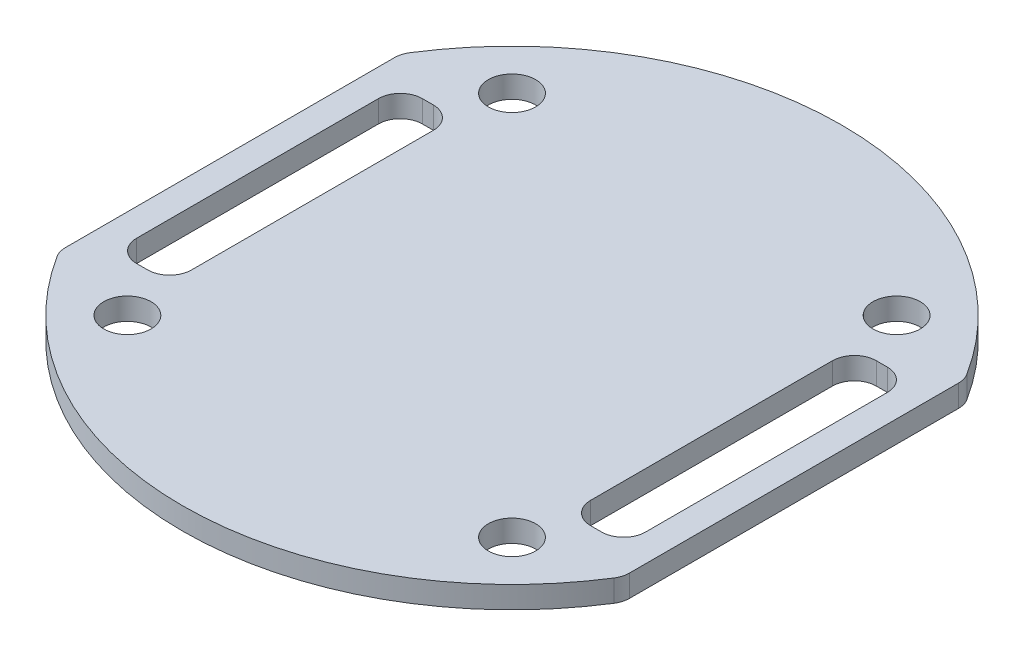
ISO-10303-21;
HEADER;
FILE_DESCRIPTION(('STEP AP214'),'2;1');
FILE_NAME('part.step','',(''),(''),'','','');
FILE_SCHEMA(('AUTOMOTIVE_DESIGN { 1 0 10303 214 1 1 1 1 }'));
ENDSEC;
DATA;
#1=APPLICATION_CONTEXT('core data for automotive mechanical design processes');
#2=APPLICATION_PROTOCOL_DEFINITION('international standard','automotive_design',2000,#1);
#3=PRODUCT_CONTEXT('',#1,'mechanical');
#4=PRODUCT('Part','Part','',(#3));
#5=PRODUCT_RELATED_PRODUCT_CATEGORY('part','',(#4));
#6=PRODUCT_DEFINITION_FORMATION('','',#4);
#7=PRODUCT_DEFINITION_CONTEXT('part definition',#1,'design');
#8=PRODUCT_DEFINITION('design','',#6,#7);
#9=PRODUCT_DEFINITION_SHAPE('','',#8);
#10=(LENGTH_UNIT() NAMED_UNIT(*) SI_UNIT(.MILLI.,.METRE.));
#11=(NAMED_UNIT(*) PLANE_ANGLE_UNIT() SI_UNIT($,.RADIAN.));
#12=(NAMED_UNIT(*) SI_UNIT($,.STERADIAN.) SOLID_ANGLE_UNIT());
#13=UNCERTAINTY_MEASURE_WITH_UNIT(LENGTH_MEASURE(1.E-05),#10,'distance_accuracy_value','');
#14=(GEOMETRIC_REPRESENTATION_CONTEXT(3) GLOBAL_UNCERTAINTY_ASSIGNED_CONTEXT((#13)) GLOBAL_UNIT_ASSIGNED_CONTEXT((#10,
#11,#12)) REPRESENTATION_CONTEXT('',''));
#15=CARTESIAN_POINT('',(0.,0.,0.));
#16=DIRECTION('',(0.,0.,1.));
#17=DIRECTION('',(1.,0.,0.));
#18=AXIS2_PLACEMENT_3D('',#15,#16,#17);
#19=CARTESIAN_POINT('',(0.,1.,0.));
#20=DIRECTION('',(0.,-1.,0.));
#21=DIRECTION('',(0.,0.,-1.));
#22=AXIS2_PLACEMENT_3D('',#19,#20,#21);
#23=CYLINDRICAL_SURFACE('',#22,30.);
#24=CARTESIAN_POINT('',(0.,-1.,0.));
#25=DIRECTION('',(0.,1.,0.));
#26=DIRECTION('',(0.,0.,1.));
#27=AXIS2_PLACEMENT_3D('',#24,#25,#26);
#28=CIRCLE('',#27,30.);
#29=CARTESIAN_POINT('',(-25.3468978210544,-1.,16.0478899188968));
#30=VERTEX_POINT('',#29);
#31=CARTESIAN_POINT('',(25.3468978210544,-1.,16.0478899188968));
#32=VERTEX_POINT('',#31);
#33=EDGE_CURVE('E225',#30,#32,#28,.T.);
#34=ORIENTED_EDGE('',*,*,#33,.T.);
#35=DIRECTION('',(0.,-1.,0.));
#36=VECTOR('',#35,1.);
#37=CARTESIAN_POINT('',(25.3468978210544,1.,16.0478899188968));
#38=LINE('',#37,#36);
#39=CARTESIAN_POINT('',(25.3468978210544,1.,16.0478899188968));
#40=VERTEX_POINT('',#39);
#41=EDGE_CURVE('E243',#32,#40,#38,.F.);
#42=ORIENTED_EDGE('',*,*,#41,.T.);
#43=CARTESIAN_POINT('',(0.,1.,0.));
#44=DIRECTION('',(0.,1.,0.));
#45=DIRECTION('',(0.,0.,1.));
#46=AXIS2_PLACEMENT_3D('',#43,#44,#45);
#47=CIRCLE('',#46,30.);
#48=CARTESIAN_POINT('',(-25.3468978210544,1.,16.0478899188968));
#49=VERTEX_POINT('',#48);
#50=EDGE_CURVE('E198',#49,#40,#47,.T.);
#51=ORIENTED_EDGE('',*,*,#50,.F.);
#52=DIRECTION('',(0.,-1.,0.));
#53=VECTOR('',#52,1.);
#54=CARTESIAN_POINT('',(-25.3468978210544,1.,16.0478899188968));
#55=LINE('',#54,#53);
#56=EDGE_CURVE('E241',#49,#30,#55,.T.);
#57=ORIENTED_EDGE('',*,*,#56,.T.);
#58=EDGE_LOOP('',(#34,#42,#51,#57));
#59=FACE_BOUND('',#58,.T.);
#60=ADVANCED_FACE('F31',(#59),#23,.T.);
#61=CARTESIAN_POINT('',(25.3468978210544,1.,-16.0478899188968));
#62=VERTEX_POINT('',#61);
#63=CARTESIAN_POINT('',(-25.3468978210544,1.,-16.0478899188968));
#64=VERTEX_POINT('',#63);
#65=EDGE_CURVE('E222',#62,#64,#47,.T.);
#66=ORIENTED_EDGE('',*,*,#65,.F.);
#67=DIRECTION('',(0.,-1.,0.));
#68=VECTOR('',#67,1.);
#69=CARTESIAN_POINT('',(25.3468978210544,1.,-16.0478899188968));
#70=LINE('',#69,#68);
#71=CARTESIAN_POINT('',(25.3468978210544,-1.,-16.0478899188968));
#72=VERTEX_POINT('',#71);
#73=EDGE_CURVE('E233',#62,#72,#70,.T.);
#74=ORIENTED_EDGE('',*,*,#73,.T.);
#75=CARTESIAN_POINT('',(-25.3468978210544,-1.,-16.0478899188968));
#76=VERTEX_POINT('',#75);
#77=EDGE_CURVE('E358',#72,#76,#28,.T.);
#78=ORIENTED_EDGE('',*,*,#77,.T.);
#79=DIRECTION('',(0.,-1.,0.));
#80=VECTOR('',#79,1.);
#81=CARTESIAN_POINT('',(-25.3468978210544,1.,-16.0478899188968));
#82=LINE('',#81,#80);
#83=EDGE_CURVE('E230',#76,#64,#82,.F.);
#84=ORIENTED_EDGE('',*,*,#83,.T.);
#85=EDGE_LOOP('',(#66,#74,#78,#84));
#86=FACE_BOUND('',#85,.T.);
#87=ADVANCED_FACE('F373',(#86),#23,.T.);
#88=CARTESIAN_POINT('',(0.,1.,0.));
#89=DIRECTION('',(0.,1.,0.));
#90=DIRECTION('',(0.,0.,1.));
#91=AXIS2_PLACEMENT_3D('',#88,#89,#90);
#92=PLANE('',#91);
#93=DIRECTION('',(0.,0.,1.));
#94=VECTOR('',#93,1.);
#95=CARTESIAN_POINT('',(-23.1571046329841,1.,-13.));
#96=LINE('',#95,#94);
#97=CARTESIAN_POINT('',(-23.1571046329841,1.,-11.));
#98=VERTEX_POINT('',#97);
#99=CARTESIAN_POINT('',(-23.1571046329841,1.,11.));
#100=VERTEX_POINT('',#99);
#101=EDGE_CURVE('E323',#98,#100,#96,.T.);
#102=ORIENTED_EDGE('',*,*,#101,.F.);
#103=CARTESIAN_POINT('',(-21.1571046329841,1.,-11.));
#104=DIRECTION('',(0.,1.,0.));
#105=DIRECTION('',(0.,0.,1.));
#106=AXIS2_PLACEMENT_3D('',#103,#104,#105);
#107=CIRCLE('',#106,2.);
#108=CARTESIAN_POINT('',(-21.1571046329841,1.,-13.));
#109=VERTEX_POINT('',#108);
#110=EDGE_CURVE('E39',#98,#109,#107,.F.);
#111=ORIENTED_EDGE('',*,*,#110,.T.);
#112=DIRECTION('',(-1.,0.,0.));
#113=VECTOR('',#112,1.);
#114=CARTESIAN_POINT('',(-23.1571046329841,1.,-13.));
#115=LINE('',#114,#113);
#116=CARTESIAN_POINT('',(-20.1571046329841,1.,-13.));
#117=VERTEX_POINT('',#116);
#118=EDGE_CURVE('E321',#117,#109,#115,.T.);
#119=ORIENTED_EDGE('',*,*,#118,.F.);
#120=CARTESIAN_POINT('',(-20.1571046329841,1.,-11.));
#121=DIRECTION('',(0.,1.,0.));
#122=DIRECTION('',(0.,0.,1.));
#123=AXIS2_PLACEMENT_3D('',#120,#121,#122);
#124=CIRCLE('',#123,2.);
#125=CARTESIAN_POINT('',(-18.1571046329841,1.,-11.));
#126=VERTEX_POINT('',#125);
#127=EDGE_CURVE('E313',#117,#126,#124,.F.);
#128=ORIENTED_EDGE('',*,*,#127,.T.);
#129=DIRECTION('',(0.,0.,-1.));
#130=VECTOR('',#129,1.);
#131=CARTESIAN_POINT('',(-18.1571046329841,1.,-13.));
#132=LINE('',#131,#130);
#133=CARTESIAN_POINT('',(-18.1571046329841,1.,11.));
#134=VERTEX_POINT('',#133);
#135=EDGE_CURVE('E333',#134,#126,#132,.T.);
#136=ORIENTED_EDGE('',*,*,#135,.F.);
#137=CARTESIAN_POINT('',(-20.1571046329841,1.,11.));
#138=DIRECTION('',(0.,1.,0.));
#139=DIRECTION('',(0.,0.,1.));
#140=AXIS2_PLACEMENT_3D('',#137,#138,#139);
#141=CIRCLE('',#140,2.);
#142=CARTESIAN_POINT('',(-20.1571046329841,1.,13.));
#143=VERTEX_POINT('',#142);
#144=EDGE_CURVE('E309',#134,#143,#141,.F.);
#145=ORIENTED_EDGE('',*,*,#144,.T.);
#146=DIRECTION('',(1.,0.,0.));
#147=VECTOR('',#146,1.);
#148=CARTESIAN_POINT('',(-23.1571046329841,1.,13.));
#149=LINE('',#148,#147);
#150=CARTESIAN_POINT('',(-21.1571046329841,1.,13.));
#151=VERTEX_POINT('',#150);
#152=EDGE_CURVE('E360',#151,#143,#149,.T.);
#153=ORIENTED_EDGE('',*,*,#152,.F.);
#154=CARTESIAN_POINT('',(-21.1571046329841,1.,11.));
#155=DIRECTION('',(0.,1.,0.));
#156=DIRECTION('',(0.,0.,1.));
#157=AXIS2_PLACEMENT_3D('',#154,#155,#156);
#158=CIRCLE('',#157,2.);
#159=EDGE_CURVE('E305',#151,#100,#158,.F.);
#160=ORIENTED_EDGE('',*,*,#159,.T.);
#161=EDGE_LOOP('',(#102,#111,#119,#128,#136,#145,#153,#160));
#162=FACE_BOUND('',#161,.T.);
#163=DIRECTION('',(0.,0.,-1.));
#164=VECTOR('',#163,1.);
#165=CARTESIAN_POINT('',(23.1571046329841,1.,-13.));
#166=LINE('',#165,#164);
#167=CARTESIAN_POINT('',(23.1571046329841,1.,11.));
#168=VERTEX_POINT('',#167);
#169=CARTESIAN_POINT('',(23.1571046329841,1.,-11.));
#170=VERTEX_POINT('',#169);
#171=EDGE_CURVE('E410',#168,#170,#166,.T.);
#172=ORIENTED_EDGE('',*,*,#171,.F.);
#173=CARTESIAN_POINT('',(21.1571046329841,1.,11.));
#174=DIRECTION('',(0.,1.,0.));
#175=DIRECTION('',(0.,0.,1.));
#176=AXIS2_PLACEMENT_3D('',#173,#174,#175);
#177=CIRCLE('',#176,2.);
#178=CARTESIAN_POINT('',(21.1571046329841,1.,13.));
#179=VERTEX_POINT('',#178);
#180=EDGE_CURVE('E297',#168,#179,#177,.F.);
#181=ORIENTED_EDGE('',*,*,#180,.T.);
#182=DIRECTION('',(1.,0.,0.));
#183=VECTOR('',#182,1.);
#184=CARTESIAN_POINT('',(23.1571046329841,1.,13.));
#185=LINE('',#184,#183);
#186=CARTESIAN_POINT('',(20.1571046329841,1.,13.));
#187=VERTEX_POINT('',#186);
#188=EDGE_CURVE('E353',#187,#179,#185,.T.);
#189=ORIENTED_EDGE('',*,*,#188,.F.);
#190=CARTESIAN_POINT('',(20.1571046329841,1.,11.));
#191=DIRECTION('',(0.,1.,0.));
#192=DIRECTION('',(0.,0.,1.));
#193=AXIS2_PLACEMENT_3D('',#190,#191,#192);
#194=CIRCLE('',#193,2.);
#195=CARTESIAN_POINT('',(18.1571046329841,1.,11.));
#196=VERTEX_POINT('',#195);
#197=EDGE_CURVE('E301',#187,#196,#194,.F.);
#198=ORIENTED_EDGE('',*,*,#197,.T.);
#199=DIRECTION('',(0.,0.,1.));
#200=VECTOR('',#199,1.);
#201=CARTESIAN_POINT('',(18.1571046329841,1.,-13.));
#202=LINE('',#201,#200);
#203=CARTESIAN_POINT('',(18.1571046329841,1.,-11.));
#204=VERTEX_POINT('',#203);
#205=EDGE_CURVE('E428',#204,#196,#202,.T.);
#206=ORIENTED_EDGE('',*,*,#205,.F.);
#207=CARTESIAN_POINT('',(20.1571046329841,1.,-11.));
#208=DIRECTION('',(0.,1.,0.));
#209=DIRECTION('',(0.,0.,1.));
#210=AXIS2_PLACEMENT_3D('',#207,#208,#209);
#211=CIRCLE('',#210,2.);
#212=CARTESIAN_POINT('',(20.1571046329841,1.,-13.));
#213=VERTEX_POINT('',#212);
#214=EDGE_CURVE('E289',#204,#213,#211,.F.);
#215=ORIENTED_EDGE('',*,*,#214,.T.);
#216=DIRECTION('',(-1.,0.,0.));
#217=VECTOR('',#216,1.);
#218=CARTESIAN_POINT('',(23.1571046329841,1.,-13.));
#219=LINE('',#218,#217);
#220=CARTESIAN_POINT('',(21.1571046329841,1.,-13.));
#221=VERTEX_POINT('',#220);
#222=EDGE_CURVE('E426',#221,#213,#219,.T.);
#223=ORIENTED_EDGE('',*,*,#222,.F.);
#224=CARTESIAN_POINT('',(21.1571046329841,1.,-11.));
#225=DIRECTION('',(0.,1.,0.));
#226=DIRECTION('',(0.,0.,1.));
#227=AXIS2_PLACEMENT_3D('',#224,#225,#226);
#228=CIRCLE('',#227,2.);
#229=EDGE_CURVE('E293',#221,#170,#228,.F.);
#230=ORIENTED_EDGE('',*,*,#229,.T.);
#231=EDGE_LOOP('',(#172,#181,#189,#198,#206,#215,#223,#230));
#232=FACE_BOUND('',#231,.T.);
#233=CARTESIAN_POINT('',(-17.5,1.,-17.5));
#234=DIRECTION('',(0.,1.,0.));
#235=DIRECTION('',(0.,0.,1.));
#236=AXIS2_PLACEMENT_3D('',#233,#234,#235);
#237=CIRCLE('',#236,2.15265);
#238=CARTESIAN_POINT('',(-17.5,1.,-15.34735));
#239=VERTEX_POINT('',#238);
#240=EDGE_CURVE('E404',#239,#239,#237,.T.);
#241=ORIENTED_EDGE('',*,*,#240,.F.);
#242=EDGE_LOOP('',(#241));
#243=FACE_BOUND('',#242,.T.);
#244=CARTESIAN_POINT('',(-17.5,1.,17.5));
#245=DIRECTION('',(0.,1.,0.));
#246=DIRECTION('',(0.,0.,1.));
#247=AXIS2_PLACEMENT_3D('',#244,#245,#246);
#248=CIRCLE('',#247,2.15265);
#249=CARTESIAN_POINT('',(-17.5,1.,19.65265));
#250=VERTEX_POINT('',#249);
#251=EDGE_CURVE('E398',#250,#250,#248,.T.);
#252=ORIENTED_EDGE('',*,*,#251,.F.);
#253=EDGE_LOOP('',(#252));
#254=FACE_BOUND('',#253,.T.);
#255=CARTESIAN_POINT('',(17.5,1.,17.5));
#256=DIRECTION('',(0.,1.,0.));
#257=DIRECTION('',(0.,0.,1.));
#258=AXIS2_PLACEMENT_3D('',#255,#256,#257);
#259=CIRCLE('',#258,2.15265);
#260=CARTESIAN_POINT('',(17.5,1.,19.65265));
#261=VERTEX_POINT('',#260);
#262=EDGE_CURVE('E392',#261,#261,#259,.T.);
#263=ORIENTED_EDGE('',*,*,#262,.F.);
#264=EDGE_LOOP('',(#263));
#265=FACE_BOUND('',#264,.T.);
#266=CARTESIAN_POINT('',(17.5,1.,-17.5));
#267=DIRECTION('',(0.,1.,0.));
#268=DIRECTION('',(0.,0.,1.));
#269=AXIS2_PLACEMENT_3D('',#266,#267,#268);
#270=CIRCLE('',#269,2.15265);
#271=CARTESIAN_POINT('',(17.5,1.,-15.34735));
#272=VERTEX_POINT('',#271);
#273=EDGE_CURVE('E385',#272,#272,#270,.T.);
#274=ORIENTED_EDGE('',*,*,#273,.F.);
#275=EDGE_LOOP('',(#274));
#276=FACE_BOUND('',#275,.T.);
#277=DIRECTION('',(0.,0.,-1.));
#278=VECTOR('',#277,1.);
#279=CARTESIAN_POINT('',(25.6571046329841,1.,0.));
#280=LINE('',#279,#278);
#281=CARTESIAN_POINT('',(25.6571046329841,1.,14.9780305909703));
#282=VERTEX_POINT('',#281);
#283=CARTESIAN_POINT('',(25.6571046329841,1.,-14.9780305909703));
#284=VERTEX_POINT('',#283);
#285=EDGE_CURVE('E196',#282,#284,#280,.T.);
#286=ORIENTED_EDGE('',*,*,#285,.T.);
#287=CARTESIAN_POINT('',(23.6571046329841,1.,-14.9780305909703));
#288=DIRECTION('',(0.,1.,0.));
#289=DIRECTION('',(0.,0.,1.));
#290=AXIS2_PLACEMENT_3D('',#287,#288,#289);
#291=CIRCLE('',#290,2.);
#292=EDGE_CURVE('E203',#284,#62,#291,.T.);
#293=ORIENTED_EDGE('',*,*,#292,.T.);
#294=ORIENTED_EDGE('',*,*,#65,.T.);
#295=CARTESIAN_POINT('',(-23.6571046329841,1.,-14.9780305909703));
#296=DIRECTION('',(0.,1.,0.));
#297=DIRECTION('',(0.,0.,1.));
#298=AXIS2_PLACEMENT_3D('',#295,#296,#297);
#299=CIRCLE('',#298,2.);
#300=CARTESIAN_POINT('',(-25.6571046329841,1.,-14.9780305909703));
#301=VERTEX_POINT('',#300);
#302=EDGE_CURVE('E220',#64,#301,#299,.T.);
#303=ORIENTED_EDGE('',*,*,#302,.T.);
#304=DIRECTION('',(0.,0.,-1.));
#305=VECTOR('',#304,1.);
#306=CARTESIAN_POINT('',(-25.6571046329841,1.,0.));
#307=LINE('',#306,#305);
#308=CARTESIAN_POINT('',(-25.6571046329841,1.,14.9780305909703));
#309=VERTEX_POINT('',#308);
#310=EDGE_CURVE('E380',#309,#301,#307,.T.);
#311=ORIENTED_EDGE('',*,*,#310,.F.);
#312=CARTESIAN_POINT('',(-23.6571046329841,1.,14.9780305909703));
#313=DIRECTION('',(0.,1.,0.));
#314=DIRECTION('',(0.,0.,1.));
#315=AXIS2_PLACEMENT_3D('',#312,#313,#314);
#316=CIRCLE('',#315,2.);
#317=EDGE_CURVE('E204',#309,#49,#316,.T.);
#318=ORIENTED_EDGE('',*,*,#317,.T.);
#319=ORIENTED_EDGE('',*,*,#50,.T.);
#320=CARTESIAN_POINT('',(23.6571046329841,1.,14.9780305909703));
#321=DIRECTION('',(0.,1.,0.));
#322=DIRECTION('',(0.,0.,1.));
#323=AXIS2_PLACEMENT_3D('',#320,#321,#322);
#324=CIRCLE('',#323,2.);
#325=EDGE_CURVE('E193',#40,#282,#324,.T.);
#326=ORIENTED_EDGE('',*,*,#325,.T.);
#327=EDGE_LOOP('',(#286,#293,#294,#303,#311,#318,#319,#326));
#328=FACE_BOUND('',#327,.T.);
#329=ADVANCED_FACE('F195',(#162,#232,#243,#254,#265,#276,#328),#92,.T.);
#330=CARTESIAN_POINT('',(0.,-1.,0.));
#331=DIRECTION('',(0.,1.,0.));
#332=DIRECTION('',(0.,0.,1.));
#333=AXIS2_PLACEMENT_3D('',#330,#331,#332);
#334=PLANE('',#333);
#335=DIRECTION('',(0.,0.,-1.));
#336=VECTOR('',#335,1.);
#337=CARTESIAN_POINT('',(-18.1571046329841,-1.,-13.));
#338=LINE('',#337,#336);
#339=CARTESIAN_POINT('',(-18.1571046329841,-1.,11.));
#340=VERTEX_POINT('',#339);
#341=CARTESIAN_POINT('',(-18.1571046329841,-1.,-11.));
#342=VERTEX_POINT('',#341);
#343=EDGE_CURVE('E350',#340,#342,#338,.T.);
#344=ORIENTED_EDGE('',*,*,#343,.T.);
#345=CARTESIAN_POINT('',(-20.1571046329841,-1.,-11.));
#346=DIRECTION('',(0.,1.,0.));
#347=DIRECTION('',(0.,0.,1.));
#348=AXIS2_PLACEMENT_3D('',#345,#346,#347);
#349=CIRCLE('',#348,2.);
#350=CARTESIAN_POINT('',(-20.1571046329841,-1.,-13.));
#351=VERTEX_POINT('',#350);
#352=EDGE_CURVE('E315',#342,#351,#349,.T.);
#353=ORIENTED_EDGE('',*,*,#352,.T.);
#354=DIRECTION('',(-1.,0.,0.));
#355=VECTOR('',#354,1.);
#356=CARTESIAN_POINT('',(-23.1571046329841,-1.,-13.));
#357=LINE('',#356,#355);
#358=CARTESIAN_POINT('',(-21.1571046329841,-1.,-13.));
#359=VERTEX_POINT('',#358);
#360=EDGE_CURVE('E343',#351,#359,#357,.T.);
#361=ORIENTED_EDGE('',*,*,#360,.T.);
#362=CARTESIAN_POINT('',(-21.1571046329841,-1.,-11.));
#363=DIRECTION('',(0.,1.,0.));
#364=DIRECTION('',(0.,0.,1.));
#365=AXIS2_PLACEMENT_3D('',#362,#363,#364);
#366=CIRCLE('',#365,2.);
#367=CARTESIAN_POINT('',(-23.1571046329841,-1.,-11.));
#368=VERTEX_POINT('',#367);
#369=EDGE_CURVE('E11',#359,#368,#366,.T.);
#370=ORIENTED_EDGE('',*,*,#369,.T.);
#371=DIRECTION('',(0.,0.,1.));
#372=VECTOR('',#371,1.);
#373=CARTESIAN_POINT('',(-23.1571046329841,-1.,-13.));
#374=LINE('',#373,#372);
#375=CARTESIAN_POINT('',(-23.1571046329841,-1.,11.));
#376=VERTEX_POINT('',#375);
#377=EDGE_CURVE('E332',#368,#376,#374,.T.);
#378=ORIENTED_EDGE('',*,*,#377,.T.);
#379=CARTESIAN_POINT('',(-21.1571046329841,-1.,11.));
#380=DIRECTION('',(0.,1.,0.));
#381=DIRECTION('',(0.,0.,1.));
#382=AXIS2_PLACEMENT_3D('',#379,#380,#381);
#383=CIRCLE('',#382,2.);
#384=CARTESIAN_POINT('',(-21.1571046329841,-1.,13.));
#385=VERTEX_POINT('',#384);
#386=EDGE_CURVE('E307',#376,#385,#383,.T.);
#387=ORIENTED_EDGE('',*,*,#386,.T.);
#388=DIRECTION('',(1.,0.,0.));
#389=VECTOR('',#388,1.);
#390=CARTESIAN_POINT('',(-23.1571046329841,-1.,13.));
#391=LINE('',#390,#389);
#392=CARTESIAN_POINT('',(-20.1571046329841,-1.,13.));
#393=VERTEX_POINT('',#392);
#394=EDGE_CURVE('E347',#385,#393,#391,.T.);
#395=ORIENTED_EDGE('',*,*,#394,.T.);
#396=CARTESIAN_POINT('',(-20.1571046329841,-1.,11.));
#397=DIRECTION('',(0.,1.,0.));
#398=DIRECTION('',(0.,0.,1.));
#399=AXIS2_PLACEMENT_3D('',#396,#397,#398);
#400=CIRCLE('',#399,2.);
#401=EDGE_CURVE('E311',#393,#340,#400,.T.);
#402=ORIENTED_EDGE('',*,*,#401,.T.);
#403=EDGE_LOOP('',(#344,#353,#361,#370,#378,#387,#395,#402));
#404=FACE_BOUND('',#403,.T.);
#405=DIRECTION('',(0.,0.,1.));
#406=VECTOR('',#405,1.);
#407=CARTESIAN_POINT('',(18.1571046329841,-1.,-13.));
#408=LINE('',#407,#406);
#409=CARTESIAN_POINT('',(18.1571046329841,-1.,-11.));
#410=VERTEX_POINT('',#409);
#411=CARTESIAN_POINT('',(18.1571046329841,-1.,11.));
#412=VERTEX_POINT('',#411);
#413=EDGE_CURVE('E419',#410,#412,#408,.T.);
#414=ORIENTED_EDGE('',*,*,#413,.T.);
#415=CARTESIAN_POINT('',(20.1571046329841,-1.,11.));
#416=DIRECTION('',(0.,1.,0.));
#417=DIRECTION('',(0.,0.,1.));
#418=AXIS2_PLACEMENT_3D('',#415,#416,#417);
#419=CIRCLE('',#418,2.);
#420=CARTESIAN_POINT('',(20.1571046329841,-1.,13.));
#421=VERTEX_POINT('',#420);
#422=EDGE_CURVE('E303',#412,#421,#419,.T.);
#423=ORIENTED_EDGE('',*,*,#422,.T.);
#424=DIRECTION('',(1.,0.,0.));
#425=VECTOR('',#424,1.);
#426=CARTESIAN_POINT('',(23.1571046329841,-1.,13.));
#427=LINE('',#426,#425);
#428=CARTESIAN_POINT('',(21.1571046329841,-1.,13.));
#429=VERTEX_POINT('',#428);
#430=EDGE_CURVE('E361',#421,#429,#427,.T.);
#431=ORIENTED_EDGE('',*,*,#430,.T.);
#432=CARTESIAN_POINT('',(21.1571046329841,-1.,11.));
#433=DIRECTION('',(0.,1.,0.));
#434=DIRECTION('',(0.,0.,1.));
#435=AXIS2_PLACEMENT_3D('',#432,#433,#434);
#436=CIRCLE('',#435,2.);
#437=CARTESIAN_POINT('',(23.1571046329841,-1.,11.));
#438=VERTEX_POINT('',#437);
#439=EDGE_CURVE('E299',#429,#438,#436,.T.);
#440=ORIENTED_EDGE('',*,*,#439,.T.);
#441=DIRECTION('',(0.,0.,-1.));
#442=VECTOR('',#441,1.);
#443=CARTESIAN_POINT('',(23.1571046329841,-1.,-13.));
#444=LINE('',#443,#442);
#445=CARTESIAN_POINT('',(23.1571046329841,-1.,-11.));
#446=VERTEX_POINT('',#445);
#447=EDGE_CURVE('E413',#438,#446,#444,.T.);
#448=ORIENTED_EDGE('',*,*,#447,.T.);
#449=CARTESIAN_POINT('',(21.1571046329841,-1.,-11.));
#450=DIRECTION('',(0.,1.,0.));
#451=DIRECTION('',(0.,0.,1.));
#452=AXIS2_PLACEMENT_3D('',#449,#450,#451);
#453=CIRCLE('',#452,2.);
#454=CARTESIAN_POINT('',(21.1571046329841,-1.,-13.));
#455=VERTEX_POINT('',#454);
#456=EDGE_CURVE('E295',#446,#455,#453,.T.);
#457=ORIENTED_EDGE('',*,*,#456,.T.);
#458=DIRECTION('',(-1.,0.,0.));
#459=VECTOR('',#458,1.);
#460=CARTESIAN_POINT('',(23.1571046329841,-1.,-13.));
#461=LINE('',#460,#459);
#462=CARTESIAN_POINT('',(20.1571046329841,-1.,-13.));
#463=VERTEX_POINT('',#462);
#464=EDGE_CURVE('E416',#455,#463,#461,.T.);
#465=ORIENTED_EDGE('',*,*,#464,.T.);
#466=CARTESIAN_POINT('',(20.1571046329841,-1.,-11.));
#467=DIRECTION('',(0.,1.,0.));
#468=DIRECTION('',(0.,0.,1.));
#469=AXIS2_PLACEMENT_3D('',#466,#467,#468);
#470=CIRCLE('',#469,2.);
#471=EDGE_CURVE('E291',#463,#410,#470,.T.);
#472=ORIENTED_EDGE('',*,*,#471,.T.);
#473=EDGE_LOOP('',(#414,#423,#431,#440,#448,#457,#465,#472));
#474=FACE_BOUND('',#473,.T.);
#475=CARTESIAN_POINT('',(-17.5,-1.,-17.5));
#476=DIRECTION('',(0.,1.,0.));
#477=DIRECTION('',(0.,0.,1.));
#478=AXIS2_PLACEMENT_3D('',#475,#476,#477);
#479=CIRCLE('',#478,2.15265);
#480=CARTESIAN_POINT('',(-17.5,-1.,-15.34735));
#481=VERTEX_POINT('',#480);
#482=EDGE_CURVE('E407',#481,#481,#479,.T.);
#483=ORIENTED_EDGE('',*,*,#482,.T.);
#484=EDGE_LOOP('',(#483));
#485=FACE_BOUND('',#484,.T.);
#486=CARTESIAN_POINT('',(-17.5,-1.,17.5));
#487=DIRECTION('',(0.,1.,0.));
#488=DIRECTION('',(0.,0.,1.));
#489=AXIS2_PLACEMENT_3D('',#486,#487,#488);
#490=CIRCLE('',#489,2.15265);
#491=CARTESIAN_POINT('',(-17.5,-1.,19.65265));
#492=VERTEX_POINT('',#491);
#493=EDGE_CURVE('E401',#492,#492,#490,.T.);
#494=ORIENTED_EDGE('',*,*,#493,.T.);
#495=EDGE_LOOP('',(#494));
#496=FACE_BOUND('',#495,.T.);
#497=CARTESIAN_POINT('',(17.5,-1.,17.5));
#498=DIRECTION('',(0.,1.,0.));
#499=DIRECTION('',(0.,0.,1.));
#500=AXIS2_PLACEMENT_3D('',#497,#498,#499);
#501=CIRCLE('',#500,2.15265);
#502=CARTESIAN_POINT('',(17.5,-1.,19.65265));
#503=VERTEX_POINT('',#502);
#504=EDGE_CURVE('E395',#503,#503,#501,.T.);
#505=ORIENTED_EDGE('',*,*,#504,.T.);
#506=EDGE_LOOP('',(#505));
#507=FACE_BOUND('',#506,.T.);
#508=CARTESIAN_POINT('',(17.5,-1.,-17.5));
#509=DIRECTION('',(0.,1.,0.));
#510=DIRECTION('',(0.,0.,1.));
#511=AXIS2_PLACEMENT_3D('',#508,#509,#510);
#512=CIRCLE('',#511,2.15265);
#513=CARTESIAN_POINT('',(17.5,-1.,-15.34735));
#514=VERTEX_POINT('',#513);
#515=EDGE_CURVE('E389',#514,#514,#512,.T.);
#516=ORIENTED_EDGE('',*,*,#515,.T.);
#517=EDGE_LOOP('',(#516));
#518=FACE_BOUND('',#517,.T.);
#519=ORIENTED_EDGE('',*,*,#77,.F.);
#520=CARTESIAN_POINT('',(23.6571046329841,-1.,-14.9780305909703));
#521=DIRECTION('',(0.,1.,0.));
#522=DIRECTION('',(0.,0.,1.));
#523=AXIS2_PLACEMENT_3D('',#520,#521,#522);
#524=CIRCLE('',#523,2.);
#525=CARTESIAN_POINT('',(25.6571046329841,-1.,-14.9780305909703));
#526=VERTEX_POINT('',#525);
#527=EDGE_CURVE('E239',#72,#526,#524,.F.);
#528=ORIENTED_EDGE('',*,*,#527,.T.);
#529=DIRECTION('',(0.,0.,-1.));
#530=VECTOR('',#529,1.);
#531=CARTESIAN_POINT('',(25.6571046329841,-1.,0.));
#532=LINE('',#531,#530);
#533=CARTESIAN_POINT('',(25.6571046329841,-1.,14.9780305909703));
#534=VERTEX_POINT('',#533);
#535=EDGE_CURVE('E214',#534,#526,#532,.T.);
#536=ORIENTED_EDGE('',*,*,#535,.F.);
#537=CARTESIAN_POINT('',(23.6571046329841,-1.,14.9780305909703));
#538=DIRECTION('',(0.,1.,0.));
#539=DIRECTION('',(0.,0.,1.));
#540=AXIS2_PLACEMENT_3D('',#537,#538,#539);
#541=CIRCLE('',#540,2.);
#542=EDGE_CURVE('E218',#534,#32,#541,.F.);
#543=ORIENTED_EDGE('',*,*,#542,.T.);
#544=ORIENTED_EDGE('',*,*,#33,.F.);
#545=CARTESIAN_POINT('',(-23.6571046329841,-1.,14.9780305909703));
#546=DIRECTION('',(0.,1.,0.));
#547=DIRECTION('',(0.,0.,1.));
#548=AXIS2_PLACEMENT_3D('',#545,#546,#547);
#549=CIRCLE('',#548,2.);
#550=CARTESIAN_POINT('',(-25.6571046329841,-1.,14.9780305909703));
#551=VERTEX_POINT('',#550);
#552=EDGE_CURVE('E53',#30,#551,#549,.F.);
#553=ORIENTED_EDGE('',*,*,#552,.T.);
#554=DIRECTION('',(0.,0.,-1.));
#555=VECTOR('',#554,1.);
#556=CARTESIAN_POINT('',(-25.6571046329841,-1.,0.));
#557=LINE('',#556,#555);
#558=CARTESIAN_POINT('',(-25.6571046329841,-1.,-14.9780305909703));
#559=VERTEX_POINT('',#558);
#560=EDGE_CURVE('E383',#551,#559,#557,.T.);
#561=ORIENTED_EDGE('',*,*,#560,.T.);
#562=CARTESIAN_POINT('',(-23.6571046329841,-1.,-14.9780305909703));
#563=DIRECTION('',(0.,1.,0.));
#564=DIRECTION('',(0.,0.,1.));
#565=AXIS2_PLACEMENT_3D('',#562,#563,#564);
#566=CIRCLE('',#565,2.);
#567=EDGE_CURVE('E235',#559,#76,#566,.F.);
#568=ORIENTED_EDGE('',*,*,#567,.T.);
#569=EDGE_LOOP('',(#519,#528,#536,#543,#544,#553,#561,#568));
#570=FACE_BOUND('',#569,.T.);
#571=ADVANCED_FACE('F340',(#404,#474,#485,#496,#507,#518,#570),#334,.F.);
#572=CARTESIAN_POINT('',(-23.1571046329841,-1.,-13.));
#573=DIRECTION('',(-1.,0.,0.));
#574=DIRECTION('',(0.,0.,1.));
#575=AXIS2_PLACEMENT_3D('',#572,#573,#574);
#576=PLANE('',#575);
#577=ORIENTED_EDGE('',*,*,#101,.T.);
#578=DIRECTION('',(0.,1.,0.));
#579=VECTOR('',#578,1.);
#580=CARTESIAN_POINT('',(-23.1571046329841,-1.,11.));
#581=LINE('',#580,#579);
#582=EDGE_CURVE('E277',#100,#376,#581,.F.);
#583=ORIENTED_EDGE('',*,*,#582,.T.);
#584=ORIENTED_EDGE('',*,*,#377,.F.);
#585=DIRECTION('',(0.,1.,0.));
#586=VECTOR('',#585,1.);
#587=CARTESIAN_POINT('',(-23.1571046329841,1.,-11.));
#588=LINE('',#587,#586);
#589=EDGE_CURVE('E274',#368,#98,#588,.T.);
#590=ORIENTED_EDGE('',*,*,#589,.T.);
#591=EDGE_LOOP('',(#577,#583,#584,#590));
#592=FACE_BOUND('',#591,.T.);
#593=ADVANCED_FACE('F345',(#592),#576,.F.);
#594=CARTESIAN_POINT('',(-23.1571046329841,-1.,-13.));
#595=DIRECTION('',(0.,0.,-1.));
#596=DIRECTION('',(-1.,0.,0.));
#597=AXIS2_PLACEMENT_3D('',#594,#595,#596);
#598=PLANE('',#597);
#599=ORIENTED_EDGE('',*,*,#360,.F.);
#600=DIRECTION('',(0.,1.,0.));
#601=VECTOR('',#600,1.);
#602=CARTESIAN_POINT('',(-20.1571046329841,1.,-13.));
#603=LINE('',#602,#601);
#604=EDGE_CURVE('E286',#351,#117,#603,.T.);
#605=ORIENTED_EDGE('',*,*,#604,.T.);
#606=ORIENTED_EDGE('',*,*,#118,.T.);
#607=DIRECTION('',(0.,1.,0.));
#608=VECTOR('',#607,1.);
#609=CARTESIAN_POINT('',(-21.1571046329841,-1.,-13.));
#610=LINE('',#609,#608);
#611=EDGE_CURVE('E284',#109,#359,#610,.F.);
#612=ORIENTED_EDGE('',*,*,#611,.T.);
#613=EDGE_LOOP('',(#599,#605,#606,#612));
#614=FACE_BOUND('',#613,.T.);
#615=ADVANCED_FACE('F329',(#614),#598,.F.);
#616=CARTESIAN_POINT('',(-18.1571046329841,-1.,-13.));
#617=DIRECTION('',(1.,0.,0.));
#618=DIRECTION('',(0.,0.,-1.));
#619=AXIS2_PLACEMENT_3D('',#616,#617,#618);
#620=PLANE('',#619);
#621=ORIENTED_EDGE('',*,*,#343,.F.);
#622=DIRECTION('',(0.,1.,0.));
#623=VECTOR('',#622,1.);
#624=CARTESIAN_POINT('',(-18.1571046329841,1.,11.));
#625=LINE('',#624,#623);
#626=EDGE_CURVE('E281',#340,#134,#625,.T.);
#627=ORIENTED_EDGE('',*,*,#626,.T.);
#628=ORIENTED_EDGE('',*,*,#135,.T.);
#629=DIRECTION('',(0.,1.,0.));
#630=VECTOR('',#629,1.);
#631=CARTESIAN_POINT('',(-18.1571046329841,-1.,-11.));
#632=LINE('',#631,#630);
#633=EDGE_CURVE('E279',#126,#342,#632,.F.);
#634=ORIENTED_EDGE('',*,*,#633,.T.);
#635=EDGE_LOOP('',(#621,#627,#628,#634));
#636=FACE_BOUND('',#635,.T.);
#637=ADVANCED_FACE('F539',(#636),#620,.F.);
#638=CARTESIAN_POINT('',(-23.1571046329841,-1.,13.));
#639=DIRECTION('',(0.,0.,1.));
#640=DIRECTION('',(1.,0.,0.));
#641=AXIS2_PLACEMENT_3D('',#638,#639,#640);
#642=PLANE('',#641);
#643=ORIENTED_EDGE('',*,*,#394,.F.);
#644=DIRECTION('',(0.,1.,0.));
#645=VECTOR('',#644,1.);
#646=CARTESIAN_POINT('',(-21.1571046329841,1.,13.));
#647=LINE('',#646,#645);
#648=EDGE_CURVE('E271',#385,#151,#647,.T.);
#649=ORIENTED_EDGE('',*,*,#648,.T.);
#650=ORIENTED_EDGE('',*,*,#152,.T.);
#651=DIRECTION('',(0.,1.,0.));
#652=VECTOR('',#651,1.);
#653=CARTESIAN_POINT('',(-20.1571046329841,-1.,13.));
#654=LINE('',#653,#652);
#655=EDGE_CURVE('E269',#143,#393,#654,.F.);
#656=ORIENTED_EDGE('',*,*,#655,.T.);
#657=EDGE_LOOP('',(#643,#649,#650,#656));
#658=FACE_BOUND('',#657,.T.);
#659=ADVANCED_FACE('F545',(#658),#642,.F.);
#660=CARTESIAN_POINT('',(23.1571046329841,-1.,-13.));
#661=DIRECTION('',(1.,0.,0.));
#662=DIRECTION('',(0.,0.,-1.));
#663=AXIS2_PLACEMENT_3D('',#660,#661,#662);
#664=PLANE('',#663);
#665=ORIENTED_EDGE('',*,*,#171,.T.);
#666=DIRECTION('',(0.,1.,0.));
#667=VECTOR('',#666,1.);
#668=CARTESIAN_POINT('',(23.1571046329841,-1.,-11.));
#669=LINE('',#668,#667);
#670=EDGE_CURVE('E262',#170,#446,#669,.F.);
#671=ORIENTED_EDGE('',*,*,#670,.T.);
#672=ORIENTED_EDGE('',*,*,#447,.F.);
#673=DIRECTION('',(0.,1.,0.));
#674=VECTOR('',#673,1.);
#675=CARTESIAN_POINT('',(23.1571046329841,1.,11.));
#676=LINE('',#675,#674);
#677=EDGE_CURVE('E259',#438,#168,#676,.T.);
#678=ORIENTED_EDGE('',*,*,#677,.T.);
#679=EDGE_LOOP('',(#665,#671,#672,#678));
#680=FACE_BOUND('',#679,.T.);
#681=ADVANCED_FACE('F448',(#680),#664,.F.);
#682=CARTESIAN_POINT('',(23.1571046329841,-1.,13.));
#683=DIRECTION('',(0.,0.,1.));
#684=DIRECTION('',(1.,0.,0.));
#685=AXIS2_PLACEMENT_3D('',#682,#683,#684);
#686=PLANE('',#685);
#687=ORIENTED_EDGE('',*,*,#188,.T.);
#688=DIRECTION('',(0.,1.,0.));
#689=VECTOR('',#688,1.);
#690=CARTESIAN_POINT('',(21.1571046329841,-1.,13.));
#691=LINE('',#690,#689);
#692=EDGE_CURVE('E267',#179,#429,#691,.F.);
#693=ORIENTED_EDGE('',*,*,#692,.T.);
#694=ORIENTED_EDGE('',*,*,#430,.F.);
#695=DIRECTION('',(0.,1.,0.));
#696=VECTOR('',#695,1.);
#697=CARTESIAN_POINT('',(20.1571046329841,1.,13.));
#698=LINE('',#697,#696);
#699=EDGE_CURVE('E264',#421,#187,#698,.T.);
#700=ORIENTED_EDGE('',*,*,#699,.T.);
#701=EDGE_LOOP('',(#687,#693,#694,#700));
#702=FACE_BOUND('',#701,.T.);
#703=ADVANCED_FACE('F437',(#702),#686,.F.);
#704=CARTESIAN_POINT('',(18.1571046329841,-1.,-13.));
#705=DIRECTION('',(-1.,0.,0.));
#706=DIRECTION('',(0.,0.,1.));
#707=AXIS2_PLACEMENT_3D('',#704,#705,#706);
#708=PLANE('',#707);
#709=ORIENTED_EDGE('',*,*,#413,.F.);
#710=DIRECTION('',(0.,1.,0.));
#711=VECTOR('',#710,1.);
#712=CARTESIAN_POINT('',(18.1571046329841,1.,-11.));
#713=LINE('',#712,#711);
#714=EDGE_CURVE('E251',#410,#204,#713,.T.);
#715=ORIENTED_EDGE('',*,*,#714,.T.);
#716=ORIENTED_EDGE('',*,*,#205,.T.);
#717=DIRECTION('',(0.,1.,0.));
#718=VECTOR('',#717,1.);
#719=CARTESIAN_POINT('',(18.1571046329841,-1.,11.));
#720=LINE('',#719,#718);
#721=EDGE_CURVE('E249',#196,#412,#720,.F.);
#722=ORIENTED_EDGE('',*,*,#721,.T.);
#723=EDGE_LOOP('',(#709,#715,#716,#722));
#724=FACE_BOUND('',#723,.T.);
#725=ADVANCED_FACE('F465',(#724),#708,.F.);
#726=CARTESIAN_POINT('',(23.1571046329841,-1.,-13.));
#727=DIRECTION('',(0.,0.,-1.));
#728=DIRECTION('',(-1.,0.,0.));
#729=AXIS2_PLACEMENT_3D('',#726,#727,#728);
#730=PLANE('',#729);
#731=ORIENTED_EDGE('',*,*,#222,.T.);
#732=DIRECTION('',(0.,1.,0.));
#733=VECTOR('',#732,1.);
#734=CARTESIAN_POINT('',(20.1571046329841,-1.,-13.));
#735=LINE('',#734,#733);
#736=EDGE_CURVE('E257',#213,#463,#735,.F.);
#737=ORIENTED_EDGE('',*,*,#736,.T.);
#738=ORIENTED_EDGE('',*,*,#464,.F.);
#739=DIRECTION('',(0.,1.,0.));
#740=VECTOR('',#739,1.);
#741=CARTESIAN_POINT('',(21.1571046329841,1.,-13.));
#742=LINE('',#741,#740);
#743=EDGE_CURVE('E254',#455,#221,#742,.T.);
#744=ORIENTED_EDGE('',*,*,#743,.T.);
#745=EDGE_LOOP('',(#731,#737,#738,#744));
#746=FACE_BOUND('',#745,.T.);
#747=ADVANCED_FACE('F457',(#746),#730,.F.);
#748=CARTESIAN_POINT('',(-17.5,-1.,-17.5));
#749=DIRECTION('',(0.,1.,0.));
#750=DIRECTION('',(0.,0.,1.));
#751=AXIS2_PLACEMENT_3D('',#748,#749,#750);
#752=CYLINDRICAL_SURFACE('',#751,2.15265);
#753=ORIENTED_EDGE('',*,*,#482,.F.);
#754=EDGE_LOOP('',(#753));
#755=FACE_BOUND('',#754,.T.);
#756=ORIENTED_EDGE('',*,*,#240,.T.);
#757=EDGE_LOOP('',(#756));
#758=FACE_BOUND('',#757,.T.);
#759=ADVANCED_FACE('F596',(#755,#758),#752,.F.);
#760=CARTESIAN_POINT('',(-17.5,-1.,17.5));
#761=DIRECTION('',(0.,1.,0.));
#762=DIRECTION('',(0.,0.,1.));
#763=AXIS2_PLACEMENT_3D('',#760,#761,#762);
#764=CYLINDRICAL_SURFACE('',#763,2.15265);
#765=ORIENTED_EDGE('',*,*,#493,.F.);
#766=EDGE_LOOP('',(#765));
#767=FACE_BOUND('',#766,.T.);
#768=ORIENTED_EDGE('',*,*,#251,.T.);
#769=EDGE_LOOP('',(#768));
#770=FACE_BOUND('',#769,.T.);
#771=ADVANCED_FACE('F489',(#767,#770),#764,.F.);
#772=CARTESIAN_POINT('',(17.5,-1.,17.5));
#773=DIRECTION('',(0.,1.,0.));
#774=DIRECTION('',(0.,0.,1.));
#775=AXIS2_PLACEMENT_3D('',#772,#773,#774);
#776=CYLINDRICAL_SURFACE('',#775,2.15265);
#777=ORIENTED_EDGE('',*,*,#504,.F.);
#778=EDGE_LOOP('',(#777));
#779=FACE_BOUND('',#778,.T.);
#780=ORIENTED_EDGE('',*,*,#262,.T.);
#781=EDGE_LOOP('',(#780));
#782=FACE_BOUND('',#781,.T.);
#783=ADVANCED_FACE('F481',(#779,#782),#776,.F.);
#784=CARTESIAN_POINT('',(17.5,-1.,-17.5));
#785=DIRECTION('',(0.,1.,0.));
#786=DIRECTION('',(0.,0.,1.));
#787=AXIS2_PLACEMENT_3D('',#784,#785,#786);
#788=CYLINDRICAL_SURFACE('',#787,2.15265);
#789=ORIENTED_EDGE('',*,*,#515,.F.);
#790=EDGE_LOOP('',(#789));
#791=FACE_BOUND('',#790,.T.);
#792=ORIENTED_EDGE('',*,*,#273,.T.);
#793=EDGE_LOOP('',(#792));
#794=FACE_BOUND('',#793,.T.);
#795=ADVANCED_FACE('F479',(#791,#794),#788,.F.);
#796=CARTESIAN_POINT('',(-25.6571046329841,-1.,0.));
#797=DIRECTION('',(1.,0.,0.));
#798=DIRECTION('',(0.,0.,-1.));
#799=AXIS2_PLACEMENT_3D('',#796,#797,#798);
#800=PLANE('',#799);
#801=ORIENTED_EDGE('',*,*,#560,.F.);
#802=DIRECTION('',(0.,-1.,0.));
#803=VECTOR('',#802,1.);
#804=CARTESIAN_POINT('',(-25.6571046329841,-1.,14.9780305909703));
#805=LINE('',#804,#803);
#806=EDGE_CURVE('E246',#551,#309,#805,.F.);
#807=ORIENTED_EDGE('',*,*,#806,.T.);
#808=ORIENTED_EDGE('',*,*,#310,.T.);
#809=DIRECTION('',(0.,-1.,0.));
#810=VECTOR('',#809,1.);
#811=CARTESIAN_POINT('',(-25.6571046329841,-1.,-14.9780305909703));
#812=LINE('',#811,#810);
#813=EDGE_CURVE('E46',#301,#559,#812,.T.);
#814=ORIENTED_EDGE('',*,*,#813,.T.);
#815=EDGE_LOOP('',(#801,#807,#808,#814));
#816=FACE_BOUND('',#815,.T.);
#817=ADVANCED_FACE('F381',(#816),#800,.F.);
#818=CARTESIAN_POINT('',(25.6571046329841,-1.,0.));
#819=DIRECTION('',(1.,0.,0.));
#820=DIRECTION('',(0.,0.,-1.));
#821=AXIS2_PLACEMENT_3D('',#818,#819,#820);
#822=PLANE('',#821);
#823=ORIENTED_EDGE('',*,*,#535,.T.);
#824=DIRECTION('',(0.,1.,0.));
#825=VECTOR('',#824,1.);
#826=CARTESIAN_POINT('',(25.6571046329841,1.,-14.9780305909703));
#827=LINE('',#826,#825);
#828=EDGE_CURVE('E213',#526,#284,#827,.T.);
#829=ORIENTED_EDGE('',*,*,#828,.T.);
#830=ORIENTED_EDGE('',*,*,#285,.F.);
#831=DIRECTION('',(0.,1.,0.));
#832=VECTOR('',#831,1.);
#833=CARTESIAN_POINT('',(25.6571046329841,-1.,14.9780305909703));
#834=LINE('',#833,#832);
#835=EDGE_CURVE('E210',#282,#534,#834,.F.);
#836=ORIENTED_EDGE('',*,*,#835,.T.);
#837=EDGE_LOOP('',(#823,#829,#830,#836));
#838=FACE_BOUND('',#837,.T.);
#839=ADVANCED_FACE('F209',(#838),#822,.T.);
#840=CARTESIAN_POINT('',(23.6571046329841,1.,-14.9780305909703));
#841=DIRECTION('',(0.,-1.,0.));
#842=DIRECTION('',(0.,0.,-1.));
#843=AXIS2_PLACEMENT_3D('',#840,#841,#842);
#844=CYLINDRICAL_SURFACE('',#843,2.);
#845=ORIENTED_EDGE('',*,*,#527,.F.);
#846=ORIENTED_EDGE('',*,*,#73,.F.);
#847=ORIENTED_EDGE('',*,*,#292,.F.);
#848=ORIENTED_EDGE('',*,*,#828,.F.);
#849=EDGE_LOOP('',(#845,#846,#847,#848));
#850=FACE_BOUND('',#849,.T.);
#851=ADVANCED_FACE('F500',(#850),#844,.T.);
#852=CARTESIAN_POINT('',(23.6571046329841,1.,14.9780305909703));
#853=DIRECTION('',(0.,-1.,0.));
#854=DIRECTION('',(0.,0.,-1.));
#855=AXIS2_PLACEMENT_3D('',#852,#853,#854);
#856=CYLINDRICAL_SURFACE('',#855,2.);
#857=ORIENTED_EDGE('',*,*,#542,.F.);
#858=ORIENTED_EDGE('',*,*,#835,.F.);
#859=ORIENTED_EDGE('',*,*,#325,.F.);
#860=ORIENTED_EDGE('',*,*,#41,.F.);
#861=EDGE_LOOP('',(#857,#858,#859,#860));
#862=FACE_BOUND('',#861,.T.);
#863=ADVANCED_FACE('F217',(#862),#856,.T.);
#864=CARTESIAN_POINT('',(-23.6571046329841,1.,14.9780305909703));
#865=DIRECTION('',(0.,-1.,0.));
#866=DIRECTION('',(0.,0.,-1.));
#867=AXIS2_PLACEMENT_3D('',#864,#865,#866);
#868=CYLINDRICAL_SURFACE('',#867,2.);
#869=ORIENTED_EDGE('',*,*,#552,.F.);
#870=ORIENTED_EDGE('',*,*,#56,.F.);
#871=ORIENTED_EDGE('',*,*,#317,.F.);
#872=ORIENTED_EDGE('',*,*,#806,.F.);
#873=EDGE_LOOP('',(#869,#870,#871,#872));
#874=FACE_BOUND('',#873,.T.);
#875=ADVANCED_FACE('F506',(#874),#868,.T.);
#876=CARTESIAN_POINT('',(-23.6571046329841,1.,-14.9780305909703));
#877=DIRECTION('',(0.,-1.,0.));
#878=DIRECTION('',(0.,0.,-1.));
#879=AXIS2_PLACEMENT_3D('',#876,#877,#878);
#880=CYLINDRICAL_SURFACE('',#879,2.);
#881=ORIENTED_EDGE('',*,*,#567,.F.);
#882=ORIENTED_EDGE('',*,*,#813,.F.);
#883=ORIENTED_EDGE('',*,*,#302,.F.);
#884=ORIENTED_EDGE('',*,*,#83,.F.);
#885=EDGE_LOOP('',(#881,#882,#883,#884));
#886=FACE_BOUND('',#885,.T.);
#887=ADVANCED_FACE('F378',(#886),#880,.T.);
#888=CARTESIAN_POINT('',(20.1571046329841,-1.,-11.));
#889=DIRECTION('',(0.,-1.,0.));
#890=DIRECTION('',(0.,0.,-1.));
#891=AXIS2_PLACEMENT_3D('',#888,#889,#890);
#892=CYLINDRICAL_SURFACE('',#891,2.);
#893=ORIENTED_EDGE('',*,*,#471,.F.);
#894=ORIENTED_EDGE('',*,*,#736,.F.);
#895=ORIENTED_EDGE('',*,*,#214,.F.);
#896=ORIENTED_EDGE('',*,*,#714,.F.);
#897=EDGE_LOOP('',(#893,#894,#895,#896));
#898=FACE_BOUND('',#897,.T.);
#899=ADVANCED_FACE('F461',(#898),#892,.F.);
#900=CARTESIAN_POINT('',(21.1571046329841,-1.,-11.));
#901=DIRECTION('',(0.,-1.,0.));
#902=DIRECTION('',(0.,0.,-1.));
#903=AXIS2_PLACEMENT_3D('',#900,#901,#902);
#904=CYLINDRICAL_SURFACE('',#903,2.);
#905=ORIENTED_EDGE('',*,*,#456,.F.);
#906=ORIENTED_EDGE('',*,*,#670,.F.);
#907=ORIENTED_EDGE('',*,*,#229,.F.);
#908=ORIENTED_EDGE('',*,*,#743,.F.);
#909=EDGE_LOOP('',(#905,#906,#907,#908));
#910=FACE_BOUND('',#909,.T.);
#911=ADVANCED_FACE('F452',(#910),#904,.F.);
#912=CARTESIAN_POINT('',(21.1571046329841,-1.,11.));
#913=DIRECTION('',(0.,-1.,0.));
#914=DIRECTION('',(0.,0.,-1.));
#915=AXIS2_PLACEMENT_3D('',#912,#913,#914);
#916=CYLINDRICAL_SURFACE('',#915,2.);
#917=ORIENTED_EDGE('',*,*,#439,.F.);
#918=ORIENTED_EDGE('',*,*,#692,.F.);
#919=ORIENTED_EDGE('',*,*,#180,.F.);
#920=ORIENTED_EDGE('',*,*,#677,.F.);
#921=EDGE_LOOP('',(#917,#918,#919,#920));
#922=FACE_BOUND('',#921,.T.);
#923=ADVANCED_FACE('F442',(#922),#916,.F.);
#924=CARTESIAN_POINT('',(20.1571046329841,-1.,11.));
#925=DIRECTION('',(0.,-1.,0.));
#926=DIRECTION('',(0.,0.,-1.));
#927=AXIS2_PLACEMENT_3D('',#924,#925,#926);
#928=CYLINDRICAL_SURFACE('',#927,2.);
#929=ORIENTED_EDGE('',*,*,#422,.F.);
#930=ORIENTED_EDGE('',*,*,#721,.F.);
#931=ORIENTED_EDGE('',*,*,#197,.F.);
#932=ORIENTED_EDGE('',*,*,#699,.F.);
#933=EDGE_LOOP('',(#929,#930,#931,#932));
#934=FACE_BOUND('',#933,.T.);
#935=ADVANCED_FACE('F467',(#934),#928,.F.);
#936=CARTESIAN_POINT('',(-21.1571046329841,-1.,11.));
#937=DIRECTION('',(0.,-1.,0.));
#938=DIRECTION('',(0.,0.,-1.));
#939=AXIS2_PLACEMENT_3D('',#936,#937,#938);
#940=CYLINDRICAL_SURFACE('',#939,2.);
#941=ORIENTED_EDGE('',*,*,#386,.F.);
#942=ORIENTED_EDGE('',*,*,#582,.F.);
#943=ORIENTED_EDGE('',*,*,#159,.F.);
#944=ORIENTED_EDGE('',*,*,#648,.F.);
#945=EDGE_LOOP('',(#941,#942,#943,#944));
#946=FACE_BOUND('',#945,.T.);
#947=ADVANCED_FACE('F520',(#946),#940,.F.);
#948=CARTESIAN_POINT('',(-20.1571046329841,-1.,11.));
#949=DIRECTION('',(0.,-1.,0.));
#950=DIRECTION('',(0.,0.,-1.));
#951=AXIS2_PLACEMENT_3D('',#948,#949,#950);
#952=CYLINDRICAL_SURFACE('',#951,2.);
#953=ORIENTED_EDGE('',*,*,#401,.F.);
#954=ORIENTED_EDGE('',*,*,#655,.F.);
#955=ORIENTED_EDGE('',*,*,#144,.F.);
#956=ORIENTED_EDGE('',*,*,#626,.F.);
#957=EDGE_LOOP('',(#953,#954,#955,#956));
#958=FACE_BOUND('',#957,.T.);
#959=ADVANCED_FACE('F523',(#958),#952,.F.);
#960=CARTESIAN_POINT('',(-20.1571046329841,-1.,-11.));
#961=DIRECTION('',(0.,-1.,0.));
#962=DIRECTION('',(0.,0.,-1.));
#963=AXIS2_PLACEMENT_3D('',#960,#961,#962);
#964=CYLINDRICAL_SURFACE('',#963,2.);
#965=ORIENTED_EDGE('',*,*,#352,.F.);
#966=ORIENTED_EDGE('',*,*,#633,.F.);
#967=ORIENTED_EDGE('',*,*,#127,.F.);
#968=ORIENTED_EDGE('',*,*,#604,.F.);
#969=EDGE_LOOP('',(#965,#966,#967,#968));
#970=FACE_BOUND('',#969,.T.);
#971=ADVANCED_FACE('F526',(#970),#964,.F.);
#972=CARTESIAN_POINT('',(-21.1571046329841,-1.,-11.));
#973=DIRECTION('',(0.,-1.,0.));
#974=DIRECTION('',(0.,0.,-1.));
#975=AXIS2_PLACEMENT_3D('',#972,#973,#974);
#976=CYLINDRICAL_SURFACE('',#975,2.);
#977=ORIENTED_EDGE('',*,*,#369,.F.);
#978=ORIENTED_EDGE('',*,*,#611,.F.);
#979=ORIENTED_EDGE('',*,*,#110,.F.);
#980=ORIENTED_EDGE('',*,*,#589,.F.);
#981=EDGE_LOOP('',(#977,#978,#979,#980));
#982=FACE_BOUND('',#981,.T.);
#983=ADVANCED_FACE('F33',(#982),#976,.F.);
#984=CLOSED_SHELL('',(#60,#87,#329,#571,#593,#615,#637,#659,#681,#703,#725,#747,#759,#771,#783,
#795,#817,#839,#851,#863,#875,#887,#899,#911,#923,#935,#947,#959,#971,#983));
#985=MANIFOLD_SOLID_BREP('B2',#984);
#986=ADVANCED_BREP_SHAPE_REPRESENTATION('',(#18,#985),#14);
#987=SHAPE_DEFINITION_REPRESENTATION(#9,#986);
ENDSEC;
END-ISO-10303-21;
